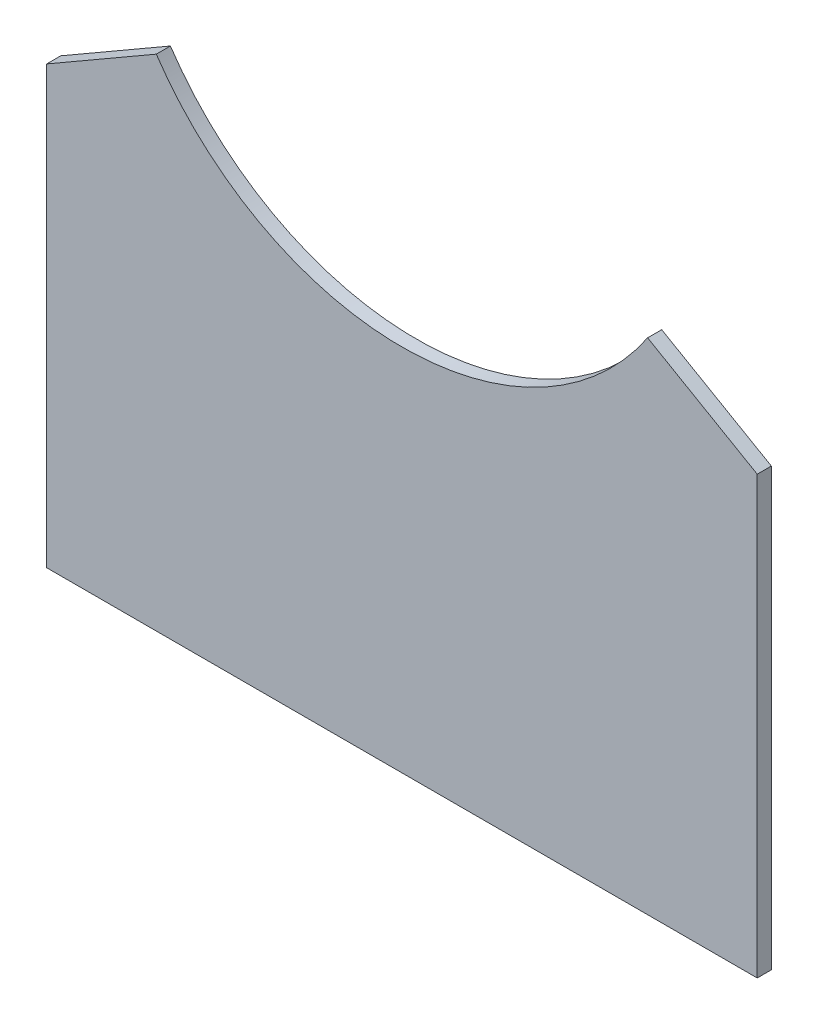
ISO-10303-21;
HEADER;
FILE_DESCRIPTION(('STEP AP214'),'2;1');
FILE_NAME('part.step','',(''),(''),'','','');
FILE_SCHEMA(('AUTOMOTIVE_DESIGN { 1 0 10303 214 1 1 1 1 }'));
ENDSEC;
DATA;
#1=APPLICATION_CONTEXT('core data for automotive mechanical design processes');
#2=APPLICATION_PROTOCOL_DEFINITION('international standard','automotive_design',2000,#1);
#3=PRODUCT_CONTEXT('',#1,'mechanical');
#4=PRODUCT('Part','Part','',(#3));
#5=PRODUCT_RELATED_PRODUCT_CATEGORY('part','',(#4));
#6=PRODUCT_DEFINITION_FORMATION('','',#4);
#7=PRODUCT_DEFINITION_CONTEXT('part definition',#1,'design');
#8=PRODUCT_DEFINITION('design','',#6,#7);
#9=PRODUCT_DEFINITION_SHAPE('','',#8);
#10=(LENGTH_UNIT() NAMED_UNIT(*) SI_UNIT(.MILLI.,.METRE.));
#11=(NAMED_UNIT(*) PLANE_ANGLE_UNIT() SI_UNIT($,.RADIAN.));
#12=(NAMED_UNIT(*) SI_UNIT($,.STERADIAN.) SOLID_ANGLE_UNIT());
#13=UNCERTAINTY_MEASURE_WITH_UNIT(LENGTH_MEASURE(1.E-05),#10,'distance_accuracy_value','');
#14=(GEOMETRIC_REPRESENTATION_CONTEXT(3) GLOBAL_UNCERTAINTY_ASSIGNED_CONTEXT((#13)) GLOBAL_UNIT_ASSIGNED_CONTEXT((#10,
#11,#12)) REPRESENTATION_CONTEXT('',''));
#15=CARTESIAN_POINT('',(0.,0.,0.));
#16=DIRECTION('',(0.,0.,1.));
#17=DIRECTION('',(1.,0.,0.));
#18=AXIS2_PLACEMENT_3D('',#15,#16,#17);
#19=CARTESIAN_POINT('',(0.,0.,6.35));
#20=DIRECTION('',(0.,0.,-1.));
#21=DIRECTION('',(-1.,0.,0.));
#22=AXIS2_PLACEMENT_3D('',#19,#20,#21);
#23=CYLINDRICAL_SURFACE('',#22,266.7);
#24=CARTESIAN_POINT('',(0.,0.,-6.35));
#25=DIRECTION('',(0.,0.,-1.));
#26=DIRECTION('',(1.,0.,0.));
#27=AXIS2_PLACEMENT_3D('',#24,#25,#26);
#28=CIRCLE('',#27,266.7);
#29=CARTESIAN_POINT('',(221.273103968574,-148.886209771465,-6.35));
#30=VERTEX_POINT('',#29);
#31=CARTESIAN_POINT('',(-221.273103968574,-148.886209771465,-6.35));
#32=VERTEX_POINT('',#31);
#33=EDGE_CURVE('E121',#30,#32,#28,.T.);
#34=ORIENTED_EDGE('',*,*,#33,.T.);
#35=DIRECTION('',(0.,0.,-1.));
#36=VECTOR('',#35,1.);
#37=CARTESIAN_POINT('',(-221.273103968574,-148.886209771465,6.35));
#38=LINE('',#37,#36);
#39=CARTESIAN_POINT('',(-221.273103968574,-148.886209771465,6.35));
#40=VERTEX_POINT('',#39);
#41=EDGE_CURVE('E11',#40,#32,#38,.T.);
#42=ORIENTED_EDGE('',*,*,#41,.F.);
#43=CARTESIAN_POINT('',(0.,0.,6.35));
#44=DIRECTION('',(0.,0.,-1.));
#45=DIRECTION('',(1.,0.,0.));
#46=AXIS2_PLACEMENT_3D('',#43,#44,#45);
#47=CIRCLE('',#46,266.7);
#48=CARTESIAN_POINT('',(221.273103968574,-148.886209771465,6.35));
#49=VERTEX_POINT('',#48);
#50=EDGE_CURVE('E131',#49,#40,#47,.T.);
#51=ORIENTED_EDGE('',*,*,#50,.F.);
#52=DIRECTION('',(0.,0.,-1.));
#53=VECTOR('',#52,1.);
#54=CARTESIAN_POINT('',(221.273103968574,-148.886209771465,6.35));
#55=LINE('',#54,#53);
#56=EDGE_CURVE('E117',#49,#30,#55,.T.);
#57=ORIENTED_EDGE('',*,*,#56,.T.);
#58=EDGE_LOOP('',(#34,#42,#51,#57));
#59=FACE_BOUND('',#58,.T.);
#60=ADVANCED_FACE('F37',(#59),#23,.F.);
#61=CARTESIAN_POINT('',(-221.273103968574,-148.886209771465,6.35));
#62=DIRECTION('',(0.499999999999998,-0.86602540378444,0.));
#63=DIRECTION('',(0.86602540378444,0.499999999999998,0.));
#64=AXIS2_PLACEMENT_3D('',#61,#62,#63);
#65=PLANE('',#64);
#66=DIRECTION('',(-0.866025403784439,-0.499999999999998,0.));
#67=VECTOR('',#66,1.);
#68=CARTESIAN_POINT('',(-221.273103968574,-148.886209771465,-6.35));
#69=LINE('',#68,#67);
#70=CARTESIAN_POINT('',(-320.,-205.886209771465,-6.35));
#71=VERTEX_POINT('',#70);
#72=EDGE_CURVE('E124',#32,#71,#69,.T.);
#73=ORIENTED_EDGE('',*,*,#72,.T.);
#74=DIRECTION('',(0.,0.,-1.));
#75=VECTOR('',#74,1.);
#76=CARTESIAN_POINT('',(-320.,-205.886209771465,6.35));
#77=LINE('',#76,#75);
#78=CARTESIAN_POINT('',(-320.,-205.886209771465,6.35));
#79=VERTEX_POINT('',#78);
#80=EDGE_CURVE('E45',#79,#71,#77,.T.);
#81=ORIENTED_EDGE('',*,*,#80,.F.);
#82=DIRECTION('',(-0.866025403784439,-0.499999999999998,0.));
#83=VECTOR('',#82,1.);
#84=CARTESIAN_POINT('',(-221.273103968574,-148.886209771465,6.35));
#85=LINE('',#84,#83);
#86=EDGE_CURVE('E90',#40,#79,#85,.T.);
#87=ORIENTED_EDGE('',*,*,#86,.F.);
#88=ORIENTED_EDGE('',*,*,#41,.T.);
#89=EDGE_LOOP('',(#73,#81,#87,#88));
#90=FACE_BOUND('',#89,.T.);
#91=ADVANCED_FACE('F155',(#90),#65,.F.);
#92=CARTESIAN_POINT('',(-320.,-205.886209771465,6.35));
#93=DIRECTION('',(1.,0.,0.));
#94=DIRECTION('',(0.,1.,0.));
#95=AXIS2_PLACEMENT_3D('',#92,#93,#94);
#96=PLANE('',#95);
#97=DIRECTION('',(0.,-1.,0.));
#98=VECTOR('',#97,1.);
#99=CARTESIAN_POINT('',(-320.,-205.886209771465,-6.35));
#100=LINE('',#99,#98);
#101=CARTESIAN_POINT('',(-320.,-598.886209771465,-6.35));
#102=VERTEX_POINT('',#101);
#103=EDGE_CURVE('E126',#71,#102,#100,.T.);
#104=ORIENTED_EDGE('',*,*,#103,.T.);
#105=DIRECTION('',(0.,0.,-1.));
#106=VECTOR('',#105,1.);
#107=CARTESIAN_POINT('',(-320.,-598.886209771465,6.35));
#108=LINE('',#107,#106);
#109=CARTESIAN_POINT('',(-320.,-598.886209771465,6.35));
#110=VERTEX_POINT('',#109);
#111=EDGE_CURVE('E112',#110,#102,#108,.T.);
#112=ORIENTED_EDGE('',*,*,#111,.F.);
#113=DIRECTION('',(0.,-1.,0.));
#114=VECTOR('',#113,1.);
#115=CARTESIAN_POINT('',(-320.,-205.886209771465,6.35));
#116=LINE('',#115,#114);
#117=EDGE_CURVE('E103',#79,#110,#116,.T.);
#118=ORIENTED_EDGE('',*,*,#117,.F.);
#119=ORIENTED_EDGE('',*,*,#80,.T.);
#120=EDGE_LOOP('',(#104,#112,#118,#119));
#121=FACE_BOUND('',#120,.T.);
#122=ADVANCED_FACE('F137',(#121),#96,.F.);
#123=CARTESIAN_POINT('',(-320.,-598.886209771465,6.35));
#124=DIRECTION('',(0.,1.,0.));
#125=DIRECTION('',(-1.,0.,0.));
#126=AXIS2_PLACEMENT_3D('',#123,#124,#125);
#127=PLANE('',#126);
#128=DIRECTION('',(1.,0.,0.));
#129=VECTOR('',#128,1.);
#130=CARTESIAN_POINT('',(-320.,-598.886209771465,-6.35));
#131=LINE('',#130,#129);
#132=CARTESIAN_POINT('',(320.,-598.886209771465,-6.35));
#133=VERTEX_POINT('',#132);
#134=EDGE_CURVE('E111',#102,#133,#131,.T.);
#135=ORIENTED_EDGE('',*,*,#134,.T.);
#136=DIRECTION('',(0.,0.,-1.));
#137=VECTOR('',#136,1.);
#138=CARTESIAN_POINT('',(320.,-598.886209771465,6.35));
#139=LINE('',#138,#137);
#140=CARTESIAN_POINT('',(320.,-598.886209771465,6.35));
#141=VERTEX_POINT('',#140);
#142=EDGE_CURVE('E108',#141,#133,#139,.T.);
#143=ORIENTED_EDGE('',*,*,#142,.F.);
#144=DIRECTION('',(1.,0.,0.));
#145=VECTOR('',#144,1.);
#146=CARTESIAN_POINT('',(-320.,-598.886209771465,6.35));
#147=LINE('',#146,#145);
#148=EDGE_CURVE('E97',#110,#141,#147,.T.);
#149=ORIENTED_EDGE('',*,*,#148,.F.);
#150=ORIENTED_EDGE('',*,*,#111,.T.);
#151=EDGE_LOOP('',(#135,#143,#149,#150));
#152=FACE_BOUND('',#151,.T.);
#153=ADVANCED_FACE('F109',(#152),#127,.F.);
#154=CARTESIAN_POINT('',(320.,-598.886209771465,6.35));
#155=DIRECTION('',(-1.,0.,0.));
#156=DIRECTION('',(0.,0.,1.));
#157=AXIS2_PLACEMENT_3D('',#154,#155,#156);
#158=PLANE('',#157);
#159=DIRECTION('',(0.,1.,0.));
#160=VECTOR('',#159,1.);
#161=CARTESIAN_POINT('',(320.,-598.886209771465,-6.35));
#162=LINE('',#161,#160);
#163=CARTESIAN_POINT('',(320.,-205.886209771465,-6.35));
#164=VERTEX_POINT('',#163);
#165=EDGE_CURVE('E76',#133,#164,#162,.T.);
#166=ORIENTED_EDGE('',*,*,#165,.T.);
#167=DIRECTION('',(0.,0.,-1.));
#168=VECTOR('',#167,1.);
#169=CARTESIAN_POINT('',(320.,-205.886209771465,6.35));
#170=LINE('',#169,#168);
#171=CARTESIAN_POINT('',(320.,-205.886209771465,6.35));
#172=VERTEX_POINT('',#171);
#173=EDGE_CURVE('E113',#172,#164,#170,.T.);
#174=ORIENTED_EDGE('',*,*,#173,.F.);
#175=DIRECTION('',(0.,1.,0.));
#176=VECTOR('',#175,1.);
#177=CARTESIAN_POINT('',(320.,-598.886209771465,6.35));
#178=LINE('',#177,#176);
#179=EDGE_CURVE('E101',#141,#172,#178,.T.);
#180=ORIENTED_EDGE('',*,*,#179,.F.);
#181=ORIENTED_EDGE('',*,*,#142,.T.);
#182=EDGE_LOOP('',(#166,#174,#180,#181));
#183=FACE_BOUND('',#182,.T.);
#184=ADVANCED_FACE('F115',(#183),#158,.F.);
#185=CARTESIAN_POINT('',(320.,-205.886209771465,6.35));
#186=DIRECTION('',(-0.499999999999998,-0.86602540378444,0.));
#187=DIRECTION('',(0.86602540378444,-0.499999999999998,0.));
#188=AXIS2_PLACEMENT_3D('',#185,#186,#187);
#189=PLANE('',#188);
#190=DIRECTION('',(-0.86602540378444,0.499999999999998,0.));
#191=VECTOR('',#190,1.);
#192=CARTESIAN_POINT('',(320.,-205.886209771465,-6.35));
#193=LINE('',#192,#191);
#194=EDGE_CURVE('E82',#164,#30,#193,.T.);
#195=ORIENTED_EDGE('',*,*,#194,.T.);
#196=ORIENTED_EDGE('',*,*,#56,.F.);
#197=DIRECTION('',(-0.86602540378444,0.499999999999998,0.));
#198=VECTOR('',#197,1.);
#199=CARTESIAN_POINT('',(320.,-205.886209771465,6.35));
#200=LINE('',#199,#198);
#201=EDGE_CURVE('E53',#172,#49,#200,.T.);
#202=ORIENTED_EDGE('',*,*,#201,.F.);
#203=ORIENTED_EDGE('',*,*,#173,.T.);
#204=EDGE_LOOP('',(#195,#196,#202,#203));
#205=FACE_BOUND('',#204,.T.);
#206=ADVANCED_FACE('F144',(#205),#189,.F.);
#207=CARTESIAN_POINT('',(0.,0.,6.35));
#208=DIRECTION('',(0.,0.,1.));
#209=DIRECTION('',(1.,0.,0.));
#210=AXIS2_PLACEMENT_3D('',#207,#208,#209);
#211=PLANE('',#210);
#212=ORIENTED_EDGE('',*,*,#50,.T.);
#213=ORIENTED_EDGE('',*,*,#86,.T.);
#214=ORIENTED_EDGE('',*,*,#117,.T.);
#215=ORIENTED_EDGE('',*,*,#148,.T.);
#216=ORIENTED_EDGE('',*,*,#179,.T.);
#217=ORIENTED_EDGE('',*,*,#201,.T.);
#218=EDGE_LOOP('',(#212,#213,#214,#215,#216,#217));
#219=FACE_BOUND('',#218,.T.);
#220=ADVANCED_FACE('F99',(#219),#211,.T.);
#221=CARTESIAN_POINT('',(0.,0.,-6.35));
#222=DIRECTION('',(0.,0.,1.));
#223=DIRECTION('',(1.,0.,0.));
#224=AXIS2_PLACEMENT_3D('',#221,#222,#223);
#225=PLANE('',#224);
#226=ORIENTED_EDGE('',*,*,#33,.F.);
#227=ORIENTED_EDGE('',*,*,#194,.F.);
#228=ORIENTED_EDGE('',*,*,#165,.F.);
#229=ORIENTED_EDGE('',*,*,#134,.F.);
#230=ORIENTED_EDGE('',*,*,#103,.F.);
#231=ORIENTED_EDGE('',*,*,#72,.F.);
#232=EDGE_LOOP('',(#226,#227,#228,#229,#230,#231));
#233=FACE_BOUND('',#232,.T.);
#234=ADVANCED_FACE('F140',(#233),#225,.F.);
#235=CLOSED_SHELL('',(#60,#91,#122,#153,#184,#206,#220,#234));
#236=MANIFOLD_SOLID_BREP('B2',#235);
#237=ADVANCED_BREP_SHAPE_REPRESENTATION('',(#18,#236),#14);
#238=SHAPE_DEFINITION_REPRESENTATION(#9,#237);
ENDSEC;
END-ISO-10303-21;
